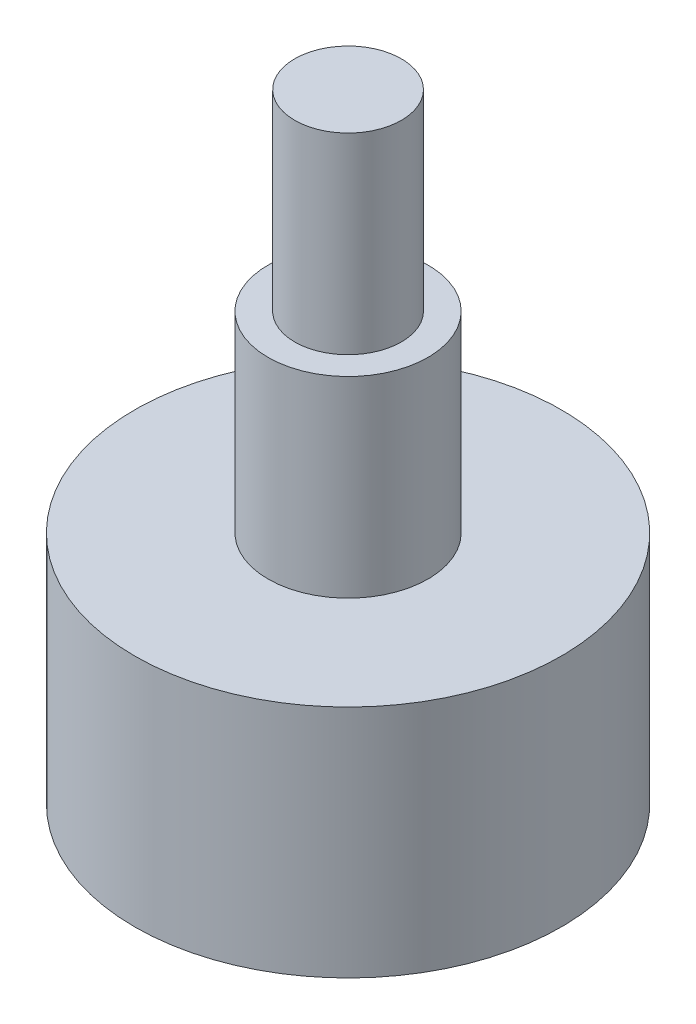
ISO-10303-21;
HEADER;
FILE_DESCRIPTION(('STEP AP214'),'2;1');
FILE_NAME('part.step','',(''),(''),'','','');
FILE_SCHEMA(('AUTOMOTIVE_DESIGN { 1 0 10303 214 1 1 1 1 }'));
ENDSEC;
DATA;
#1=APPLICATION_CONTEXT('core data for automotive mechanical design processes');
#2=APPLICATION_PROTOCOL_DEFINITION('international standard','automotive_design',2000,#1);
#3=PRODUCT_CONTEXT('',#1,'mechanical');
#4=PRODUCT('Part','Part','',(#3));
#5=PRODUCT_RELATED_PRODUCT_CATEGORY('part','',(#4));
#6=PRODUCT_DEFINITION_FORMATION('','',#4);
#7=PRODUCT_DEFINITION_CONTEXT('part definition',#1,'design');
#8=PRODUCT_DEFINITION('design','',#6,#7);
#9=PRODUCT_DEFINITION_SHAPE('','',#8);
#10=(LENGTH_UNIT() NAMED_UNIT(*) SI_UNIT(.MILLI.,.METRE.));
#11=(NAMED_UNIT(*) PLANE_ANGLE_UNIT() SI_UNIT($,.RADIAN.));
#12=(NAMED_UNIT(*) SI_UNIT($,.STERADIAN.) SOLID_ANGLE_UNIT());
#13=UNCERTAINTY_MEASURE_WITH_UNIT(LENGTH_MEASURE(1.E-05),#10,'distance_accuracy_value','');
#14=(GEOMETRIC_REPRESENTATION_CONTEXT(3) GLOBAL_UNCERTAINTY_ASSIGNED_CONTEXT((#13)) GLOBAL_UNIT_ASSIGNED_CONTEXT((#10,
#11,#12)) REPRESENTATION_CONTEXT('',''));
#15=CARTESIAN_POINT('',(0.,0.,0.));
#16=DIRECTION('',(0.,0.,1.));
#17=DIRECTION('',(1.,0.,0.));
#18=AXIS2_PLACEMENT_3D('',#15,#16,#17);
#19=CARTESIAN_POINT('',(0.,25.4,0.));
#20=DIRECTION('',(0.,1.,0.));
#21=DIRECTION('',(0.,0.,1.));
#22=AXIS2_PLACEMENT_3D('',#19,#20,#21);
#23=PLANE('',#22);
#24=CARTESIAN_POINT('',(0.,25.4,0.));
#25=DIRECTION('',(0.,1.,0.));
#26=DIRECTION('',(0.,0.,1.));
#27=AXIS2_PLACEMENT_3D('',#24,#25,#26);
#28=CIRCLE('',#27,4.7625);
#29=CARTESIAN_POINT('',(0.,25.4,4.7625));
#30=VERTEX_POINT('',#29);
#31=EDGE_CURVE('E42',#30,#30,#28,.T.);
#32=ORIENTED_EDGE('',*,*,#31,.T.);
#33=EDGE_LOOP('',(#32));
#34=FACE_BOUND('',#33,.T.);
#35=CARTESIAN_POINT('',(0.,25.4,0.));
#36=DIRECTION('',(0.,1.,0.));
#37=DIRECTION('',(0.,0.,1.));
#38=AXIS2_PLACEMENT_3D('',#35,#36,#37);
#39=CIRCLE('',#38,3.175);
#40=CARTESIAN_POINT('',(0.,25.4,3.175));
#41=VERTEX_POINT('',#40);
#42=EDGE_CURVE('E50',#41,#41,#39,.T.);
#43=ORIENTED_EDGE('',*,*,#42,.F.);
#44=EDGE_LOOP('',(#43));
#45=FACE_BOUND('',#44,.T.);
#46=ADVANCED_FACE('F31',(#34,#45),#23,.T.);
#47=CARTESIAN_POINT('',(0.,13.97,0.));
#48=DIRECTION('',(0.,1.,0.));
#49=DIRECTION('',(0.,0.,1.));
#50=AXIS2_PLACEMENT_3D('',#47,#48,#49);
#51=PLANE('',#50);
#52=CARTESIAN_POINT('',(0.,13.97,0.));
#53=DIRECTION('',(0.,1.,0.));
#54=DIRECTION('',(0.,0.,1.));
#55=AXIS2_PLACEMENT_3D('',#52,#53,#54);
#56=CIRCLE('',#55,12.7);
#57=CARTESIAN_POINT('',(0.,13.97,12.7));
#58=VERTEX_POINT('',#57);
#59=EDGE_CURVE('E10',#58,#58,#56,.T.);
#60=ORIENTED_EDGE('',*,*,#59,.T.);
#61=EDGE_LOOP('',(#60));
#62=FACE_BOUND('',#61,.T.);
#63=CARTESIAN_POINT('',(0.,13.97,0.));
#64=DIRECTION('',(0.,1.,0.));
#65=DIRECTION('',(0.,0.,1.));
#66=AXIS2_PLACEMENT_3D('',#63,#64,#65);
#67=CIRCLE('',#66,4.7625);
#68=CARTESIAN_POINT('',(0.,13.97,4.7625));
#69=VERTEX_POINT('',#68);
#70=EDGE_CURVE('E44',#69,#69,#67,.T.);
#71=ORIENTED_EDGE('',*,*,#70,.F.);
#72=EDGE_LOOP('',(#71));
#73=FACE_BOUND('',#72,.T.);
#74=ADVANCED_FACE('F66',(#62,#73),#51,.T.);
#75=CARTESIAN_POINT('',(0.,13.97,0.));
#76=DIRECTION('',(0.,-1.,0.));
#77=DIRECTION('',(0.,0.,-1.));
#78=AXIS2_PLACEMENT_3D('',#75,#76,#77);
#79=CYLINDRICAL_SURFACE('',#78,12.7);
#80=ORIENTED_EDGE('',*,*,#59,.F.);
#81=EDGE_LOOP('',(#80));
#82=FACE_BOUND('',#81,.T.);
#83=CARTESIAN_POINT('',(0.,0.,0.));
#84=DIRECTION('',(0.,1.,0.));
#85=DIRECTION('',(0.,0.,1.));
#86=AXIS2_PLACEMENT_3D('',#83,#84,#85);
#87=CIRCLE('',#86,12.7);
#88=CARTESIAN_POINT('',(0.,0.,12.7));
#89=VERTEX_POINT('',#88);
#90=EDGE_CURVE('E35',#89,#89,#87,.T.);
#91=ORIENTED_EDGE('',*,*,#90,.T.);
#92=EDGE_LOOP('',(#91));
#93=FACE_BOUND('',#92,.T.);
#94=ADVANCED_FACE('F33',(#82,#93),#79,.T.);
#95=CARTESIAN_POINT('',(0.,0.,0.));
#96=DIRECTION('',(0.,1.,0.));
#97=DIRECTION('',(0.,0.,1.));
#98=AXIS2_PLACEMENT_3D('',#95,#96,#97);
#99=PLANE('',#98);
#100=ORIENTED_EDGE('',*,*,#90,.F.);
#101=EDGE_LOOP('',(#100));
#102=FACE_BOUND('',#101,.T.);
#103=ADVANCED_FACE('F76',(#102),#99,.F.);
#104=CARTESIAN_POINT('',(0.,25.4,0.));
#105=DIRECTION('',(0.,-1.,0.));
#106=DIRECTION('',(0.,0.,-1.));
#107=AXIS2_PLACEMENT_3D('',#104,#105,#106);
#108=CYLINDRICAL_SURFACE('',#107,4.7625);
#109=ORIENTED_EDGE('',*,*,#31,.F.);
#110=EDGE_LOOP('',(#109));
#111=FACE_BOUND('',#110,.T.);
#112=ORIENTED_EDGE('',*,*,#70,.T.);
#113=EDGE_LOOP('',(#112));
#114=FACE_BOUND('',#113,.T.);
#115=ADVANCED_FACE('F61',(#111,#114),#108,.T.);
#116=CARTESIAN_POINT('',(0.,36.83,0.));
#117=DIRECTION('',(0.,-1.,0.));
#118=DIRECTION('',(0.,0.,-1.));
#119=AXIS2_PLACEMENT_3D('',#116,#117,#118);
#120=CYLINDRICAL_SURFACE('',#119,3.175);
#121=CARTESIAN_POINT('',(0.,36.83,0.));
#122=DIRECTION('',(0.,1.,0.));
#123=DIRECTION('',(0.,0.,1.));
#124=AXIS2_PLACEMENT_3D('',#121,#122,#123);
#125=CIRCLE('',#124,3.175);
#126=CARTESIAN_POINT('',(0.,36.83,3.175));
#127=VERTEX_POINT('',#126);
#128=EDGE_CURVE('E47',#127,#127,#125,.T.);
#129=ORIENTED_EDGE('',*,*,#128,.F.);
#130=EDGE_LOOP('',(#129));
#131=FACE_BOUND('',#130,.T.);
#132=ORIENTED_EDGE('',*,*,#42,.T.);
#133=EDGE_LOOP('',(#132));
#134=FACE_BOUND('',#133,.T.);
#135=ADVANCED_FACE('F58',(#131,#134),#120,.T.);
#136=CARTESIAN_POINT('',(0.,36.83,0.));
#137=DIRECTION('',(0.,1.,0.));
#138=DIRECTION('',(0.,0.,1.));
#139=AXIS2_PLACEMENT_3D('',#136,#137,#138);
#140=PLANE('',#139);
#141=ORIENTED_EDGE('',*,*,#128,.T.);
#142=EDGE_LOOP('',(#141));
#143=FACE_BOUND('',#142,.T.);
#144=ADVANCED_FACE('F56',(#143),#140,.T.);
#145=CLOSED_SHELL('',(#46,#74,#94,#103,#115,#135,#144));
#146=MANIFOLD_SOLID_BREP('B2',#145);
#147=ADVANCED_BREP_SHAPE_REPRESENTATION('',(#18,#146),#14);
#148=SHAPE_DEFINITION_REPRESENTATION(#9,#147);
ENDSEC;
END-ISO-10303-21;
